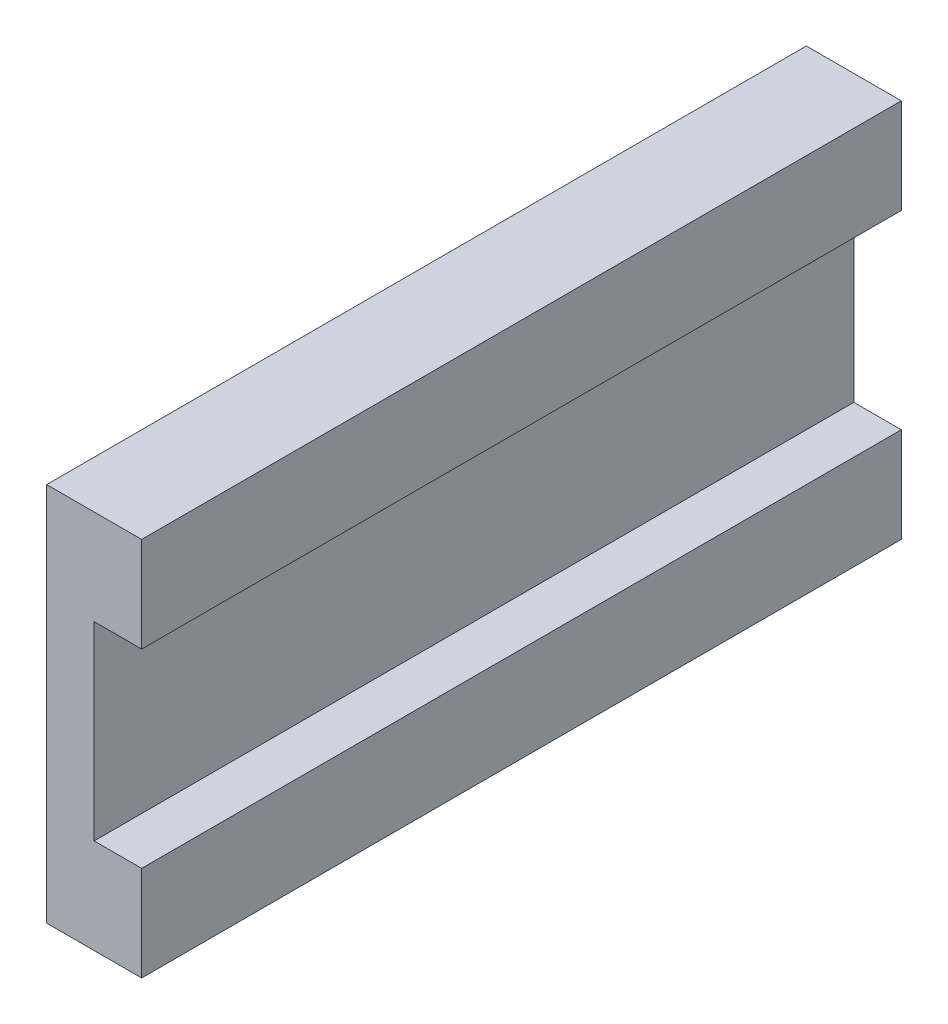
ISO-10303-21;
HEADER;
FILE_DESCRIPTION(('STEP AP214'),'2;1');
FILE_NAME('part.step','',(''),(''),'','','');
FILE_SCHEMA(('AUTOMOTIVE_DESIGN { 1 0 10303 214 1 1 1 1 }'));
ENDSEC;
DATA;
#1=APPLICATION_CONTEXT('core data for automotive mechanical design processes');
#2=APPLICATION_PROTOCOL_DEFINITION('international standard','automotive_design',2000,#1);
#3=PRODUCT_CONTEXT('',#1,'mechanical');
#4=PRODUCT('Part','Part','',(#3));
#5=PRODUCT_RELATED_PRODUCT_CATEGORY('part','',(#4));
#6=PRODUCT_DEFINITION_FORMATION('','',#4);
#7=PRODUCT_DEFINITION_CONTEXT('part definition',#1,'design');
#8=PRODUCT_DEFINITION('design','',#6,#7);
#9=PRODUCT_DEFINITION_SHAPE('','',#8);
#10=(LENGTH_UNIT() NAMED_UNIT(*) SI_UNIT(.MILLI.,.METRE.));
#11=(NAMED_UNIT(*) PLANE_ANGLE_UNIT() SI_UNIT($,.RADIAN.));
#12=(NAMED_UNIT(*) SI_UNIT($,.STERADIAN.) SOLID_ANGLE_UNIT());
#13=UNCERTAINTY_MEASURE_WITH_UNIT(LENGTH_MEASURE(1.E-05),#10,'distance_accuracy_value','');
#14=(GEOMETRIC_REPRESENTATION_CONTEXT(3) GLOBAL_UNCERTAINTY_ASSIGNED_CONTEXT((#13)) GLOBAL_UNIT_ASSIGNED_CONTEXT((#10,
#11,#12)) REPRESENTATION_CONTEXT('',''));
#15=CARTESIAN_POINT('',(0.,0.,0.));
#16=DIRECTION('',(0.,0.,1.));
#17=DIRECTION('',(1.,0.,0.));
#18=AXIS2_PLACEMENT_3D('',#15,#16,#17);
#19=CARTESIAN_POINT('',(20.,0.,80.));
#20=DIRECTION('',(0.,1.,0.));
#21=DIRECTION('',(0.,0.,1.));
#22=AXIS2_PLACEMENT_3D('',#19,#20,#21);
#23=PLANE('',#22);
#24=DIRECTION('',(1.,0.,0.));
#25=VECTOR('',#24,1.);
#26=CARTESIAN_POINT('',(20.,0.,-80.));
#27=LINE('',#26,#25);
#28=CARTESIAN_POINT('',(0.,0.,-80.));
#29=VERTEX_POINT('',#28);
#30=CARTESIAN_POINT('',(20.,0.,-80.));
#31=VERTEX_POINT('',#30);
#32=EDGE_CURVE('E131',#29,#31,#27,.T.);
#33=ORIENTED_EDGE('',*,*,#32,.T.);
#34=DIRECTION('',(0.,0.,-1.));
#35=VECTOR('',#34,1.);
#36=CARTESIAN_POINT('',(20.,0.,80.));
#37=LINE('',#36,#35);
#38=CARTESIAN_POINT('',(20.,0.,80.));
#39=VERTEX_POINT('',#38);
#40=EDGE_CURVE('E11',#39,#31,#37,.T.);
#41=ORIENTED_EDGE('',*,*,#40,.F.);
#42=DIRECTION('',(1.,0.,0.));
#43=VECTOR('',#42,1.);
#44=CARTESIAN_POINT('',(20.,0.,80.));
#45=LINE('',#44,#43);
#46=CARTESIAN_POINT('',(0.,0.,80.));
#47=VERTEX_POINT('',#46);
#48=EDGE_CURVE('E145',#47,#39,#45,.T.);
#49=ORIENTED_EDGE('',*,*,#48,.F.);
#50=DIRECTION('',(0.,0.,-1.));
#51=VECTOR('',#50,1.);
#52=CARTESIAN_POINT('',(0.,0.,80.));
#53=LINE('',#52,#51);
#54=EDGE_CURVE('E127',#47,#29,#53,.T.);
#55=ORIENTED_EDGE('',*,*,#54,.T.);
#56=EDGE_LOOP('',(#33,#41,#49,#55));
#57=FACE_BOUND('',#56,.T.);
#58=ADVANCED_FACE('F35',(#57),#23,.F.);
#59=CARTESIAN_POINT('',(20.,20.,80.));
#60=DIRECTION('',(-1.,0.,0.));
#61=DIRECTION('',(0.,-1.,0.));
#62=AXIS2_PLACEMENT_3D('',#59,#60,#61);
#63=PLANE('',#62);
#64=DIRECTION('',(0.,1.,0.));
#65=VECTOR('',#64,1.);
#66=CARTESIAN_POINT('',(20.,20.,-80.));
#67=LINE('',#66,#65);
#68=CARTESIAN_POINT('',(20.,20.,-80.));
#69=VERTEX_POINT('',#68);
#70=EDGE_CURVE('E134',#31,#69,#67,.T.);
#71=ORIENTED_EDGE('',*,*,#70,.T.);
#72=DIRECTION('',(0.,0.,-1.));
#73=VECTOR('',#72,1.);
#74=CARTESIAN_POINT('',(20.,20.,80.));
#75=LINE('',#74,#73);
#76=CARTESIAN_POINT('',(20.,20.,80.));
#77=VERTEX_POINT('',#76);
#78=EDGE_CURVE('E43',#77,#69,#75,.T.);
#79=ORIENTED_EDGE('',*,*,#78,.F.);
#80=DIRECTION('',(0.,1.,0.));
#81=VECTOR('',#80,1.);
#82=CARTESIAN_POINT('',(20.,20.,80.));
#83=LINE('',#82,#81);
#84=EDGE_CURVE('E94',#39,#77,#83,.T.);
#85=ORIENTED_EDGE('',*,*,#84,.F.);
#86=ORIENTED_EDGE('',*,*,#40,.T.);
#87=EDGE_LOOP('',(#71,#79,#85,#86));
#88=FACE_BOUND('',#87,.T.);
#89=ADVANCED_FACE('F180',(#88),#63,.F.);
#90=CARTESIAN_POINT('',(10.,20.,80.));
#91=DIRECTION('',(0.,-1.,0.));
#92=DIRECTION('',(0.,0.,-1.));
#93=AXIS2_PLACEMENT_3D('',#90,#91,#92);
#94=PLANE('',#93);
#95=DIRECTION('',(-1.,0.,0.));
#96=VECTOR('',#95,1.);
#97=CARTESIAN_POINT('',(10.,20.,-80.));
#98=LINE('',#97,#96);
#99=CARTESIAN_POINT('',(10.,20.,-80.));
#100=VERTEX_POINT('',#99);
#101=EDGE_CURVE('E136',#69,#100,#98,.T.);
#102=ORIENTED_EDGE('',*,*,#101,.T.);
#103=DIRECTION('',(0.,0.,-1.));
#104=VECTOR('',#103,1.);
#105=CARTESIAN_POINT('',(10.,20.,80.));
#106=LINE('',#105,#104);
#107=CARTESIAN_POINT('',(10.,20.,80.));
#108=VERTEX_POINT('',#107);
#109=EDGE_CURVE('E152',#108,#100,#106,.T.);
#110=ORIENTED_EDGE('',*,*,#109,.F.);
#111=DIRECTION('',(-1.,0.,0.));
#112=VECTOR('',#111,1.);
#113=CARTESIAN_POINT('',(10.,20.,80.));
#114=LINE('',#113,#112);
#115=EDGE_CURVE('E160',#77,#108,#114,.T.);
#116=ORIENTED_EDGE('',*,*,#115,.F.);
#117=ORIENTED_EDGE('',*,*,#78,.T.);
#118=EDGE_LOOP('',(#102,#110,#116,#117));
#119=FACE_BOUND('',#118,.T.);
#120=ADVANCED_FACE('F158',(#119),#94,.F.);
#121=CARTESIAN_POINT('',(10.,60.,80.));
#122=DIRECTION('',(-1.,0.,0.));
#123=DIRECTION('',(0.,-1.,0.));
#124=AXIS2_PLACEMENT_3D('',#121,#122,#123);
#125=PLANE('',#124);
#126=DIRECTION('',(0.,1.,0.));
#127=VECTOR('',#126,1.);
#128=CARTESIAN_POINT('',(10.,60.,-80.));
#129=LINE('',#128,#127);
#130=CARTESIAN_POINT('',(10.,60.,-80.));
#131=VERTEX_POINT('',#130);
#132=EDGE_CURVE('E138',#100,#131,#129,.T.);
#133=ORIENTED_EDGE('',*,*,#132,.T.);
#134=DIRECTION('',(0.,0.,-1.));
#135=VECTOR('',#134,1.);
#136=CARTESIAN_POINT('',(10.,60.,80.));
#137=LINE('',#136,#135);
#138=CARTESIAN_POINT('',(10.,60.,80.));
#139=VERTEX_POINT('',#138);
#140=EDGE_CURVE('E149',#139,#131,#137,.T.);
#141=ORIENTED_EDGE('',*,*,#140,.F.);
#142=DIRECTION('',(0.,1.,0.));
#143=VECTOR('',#142,1.);
#144=CARTESIAN_POINT('',(10.,60.,80.));
#145=LINE('',#144,#143);
#146=EDGE_CURVE('E172',#108,#139,#145,.T.);
#147=ORIENTED_EDGE('',*,*,#146,.F.);
#148=ORIENTED_EDGE('',*,*,#109,.T.);
#149=EDGE_LOOP('',(#133,#141,#147,#148));
#150=FACE_BOUND('',#149,.T.);
#151=ADVANCED_FACE('F168',(#150),#125,.F.);
#152=CARTESIAN_POINT('',(20.,60.,80.));
#153=DIRECTION('',(0.,1.,0.));
#154=DIRECTION('',(0.,0.,1.));
#155=AXIS2_PLACEMENT_3D('',#152,#153,#154);
#156=PLANE('',#155);
#157=DIRECTION('',(1.,0.,0.));
#158=VECTOR('',#157,1.);
#159=CARTESIAN_POINT('',(20.,60.,-80.));
#160=LINE('',#159,#158);
#161=CARTESIAN_POINT('',(20.,60.,-80.));
#162=VERTEX_POINT('',#161);
#163=EDGE_CURVE('E140',#131,#162,#160,.T.);
#164=ORIENTED_EDGE('',*,*,#163,.T.);
#165=DIRECTION('',(0.,0.,-1.));
#166=VECTOR('',#165,1.);
#167=CARTESIAN_POINT('',(20.,60.,80.));
#168=LINE('',#167,#166);
#169=CARTESIAN_POINT('',(20.,60.,80.));
#170=VERTEX_POINT('',#169);
#171=EDGE_CURVE('E122',#170,#162,#168,.T.);
#172=ORIENTED_EDGE('',*,*,#171,.F.);
#173=DIRECTION('',(1.,0.,0.));
#174=VECTOR('',#173,1.);
#175=CARTESIAN_POINT('',(20.,60.,80.));
#176=LINE('',#175,#174);
#177=EDGE_CURVE('E113',#139,#170,#176,.T.);
#178=ORIENTED_EDGE('',*,*,#177,.F.);
#179=ORIENTED_EDGE('',*,*,#140,.T.);
#180=EDGE_LOOP('',(#164,#172,#178,#179));
#181=FACE_BOUND('',#180,.T.);
#182=ADVANCED_FACE('F171',(#181),#156,.F.);
#183=CARTESIAN_POINT('',(20.,80.,80.));
#184=DIRECTION('',(-1.,0.,0.));
#185=DIRECTION('',(0.,-1.,0.));
#186=AXIS2_PLACEMENT_3D('',#183,#184,#185);
#187=PLANE('',#186);
#188=DIRECTION('',(0.,1.,0.));
#189=VECTOR('',#188,1.);
#190=CARTESIAN_POINT('',(20.,80.,-80.));
#191=LINE('',#190,#189);
#192=CARTESIAN_POINT('',(20.,80.,-80.));
#193=VERTEX_POINT('',#192);
#194=EDGE_CURVE('E121',#162,#193,#191,.T.);
#195=ORIENTED_EDGE('',*,*,#194,.T.);
#196=DIRECTION('',(0.,0.,-1.));
#197=VECTOR('',#196,1.);
#198=CARTESIAN_POINT('',(20.,80.,80.));
#199=LINE('',#198,#197);
#200=CARTESIAN_POINT('',(20.,80.,80.));
#201=VERTEX_POINT('',#200);
#202=EDGE_CURVE('E118',#201,#193,#199,.T.);
#203=ORIENTED_EDGE('',*,*,#202,.F.);
#204=DIRECTION('',(0.,1.,0.));
#205=VECTOR('',#204,1.);
#206=CARTESIAN_POINT('',(20.,80.,80.));
#207=LINE('',#206,#205);
#208=EDGE_CURVE('E107',#170,#201,#207,.T.);
#209=ORIENTED_EDGE('',*,*,#208,.F.);
#210=ORIENTED_EDGE('',*,*,#171,.T.);
#211=EDGE_LOOP('',(#195,#203,#209,#210));
#212=FACE_BOUND('',#211,.T.);
#213=ADVANCED_FACE('F119',(#212),#187,.F.);
#214=CARTESIAN_POINT('',(0.,80.,80.));
#215=DIRECTION('',(0.,-1.,0.));
#216=DIRECTION('',(0.,0.,-1.));
#217=AXIS2_PLACEMENT_3D('',#214,#215,#216);
#218=PLANE('',#217);
#219=DIRECTION('',(-1.,0.,0.));
#220=VECTOR('',#219,1.);
#221=CARTESIAN_POINT('',(0.,80.,-80.));
#222=LINE('',#221,#220);
#223=CARTESIAN_POINT('',(0.,80.,-80.));
#224=VERTEX_POINT('',#223);
#225=EDGE_CURVE('E80',#193,#224,#222,.T.);
#226=ORIENTED_EDGE('',*,*,#225,.T.);
#227=DIRECTION('',(0.,0.,-1.));
#228=VECTOR('',#227,1.);
#229=CARTESIAN_POINT('',(0.,80.,80.));
#230=LINE('',#229,#228);
#231=CARTESIAN_POINT('',(0.,80.,80.));
#232=VERTEX_POINT('',#231);
#233=EDGE_CURVE('E123',#232,#224,#230,.T.);
#234=ORIENTED_EDGE('',*,*,#233,.F.);
#235=DIRECTION('',(-1.,0.,0.));
#236=VECTOR('',#235,1.);
#237=CARTESIAN_POINT('',(0.,80.,80.));
#238=LINE('',#237,#236);
#239=EDGE_CURVE('E111',#201,#232,#238,.T.);
#240=ORIENTED_EDGE('',*,*,#239,.F.);
#241=ORIENTED_EDGE('',*,*,#202,.T.);
#242=EDGE_LOOP('',(#226,#234,#240,#241));
#243=FACE_BOUND('',#242,.T.);
#244=ADVANCED_FACE('F125',(#243),#218,.F.);
#245=CARTESIAN_POINT('',(0.,0.,80.));
#246=DIRECTION('',(1.,0.,0.));
#247=DIRECTION('',(0.,0.,-1.));
#248=AXIS2_PLACEMENT_3D('',#245,#246,#247);
#249=PLANE('',#248);
#250=DIRECTION('',(0.,-1.,0.));
#251=VECTOR('',#250,1.);
#252=CARTESIAN_POINT('',(0.,0.,-80.));
#253=LINE('',#252,#251);
#254=EDGE_CURVE('E86',#224,#29,#253,.T.);
#255=ORIENTED_EDGE('',*,*,#254,.T.);
#256=ORIENTED_EDGE('',*,*,#54,.F.);
#257=DIRECTION('',(0.,-1.,0.));
#258=VECTOR('',#257,1.);
#259=CARTESIAN_POINT('',(0.,0.,80.));
#260=LINE('',#259,#258);
#261=EDGE_CURVE('E51',#232,#47,#260,.T.);
#262=ORIENTED_EDGE('',*,*,#261,.F.);
#263=ORIENTED_EDGE('',*,*,#233,.T.);
#264=EDGE_LOOP('',(#255,#256,#262,#263));
#265=FACE_BOUND('',#264,.T.);
#266=ADVANCED_FACE('F196',(#265),#249,.F.);
#267=CARTESIAN_POINT('',(0.,0.,80.));
#268=DIRECTION('',(0.,0.,-1.));
#269=DIRECTION('',(-1.,0.,0.));
#270=AXIS2_PLACEMENT_3D('',#267,#268,#269);
#271=PLANE('',#270);
#272=ORIENTED_EDGE('',*,*,#48,.T.);
#273=ORIENTED_EDGE('',*,*,#84,.T.);
#274=ORIENTED_EDGE('',*,*,#115,.T.);
#275=ORIENTED_EDGE('',*,*,#146,.T.);
#276=ORIENTED_EDGE('',*,*,#177,.T.);
#277=ORIENTED_EDGE('',*,*,#208,.T.);
#278=ORIENTED_EDGE('',*,*,#239,.T.);
#279=ORIENTED_EDGE('',*,*,#261,.T.);
#280=EDGE_LOOP('',(#272,#273,#274,#275,#276,#277,#278,#279));
#281=FACE_BOUND('',#280,.T.);
#282=ADVANCED_FACE('F109',(#281),#271,.F.);
#283=CARTESIAN_POINT('',(0.,0.,-80.));
#284=DIRECTION('',(0.,0.,-1.));
#285=DIRECTION('',(-1.,0.,0.));
#286=AXIS2_PLACEMENT_3D('',#283,#284,#285);
#287=PLANE('',#286);
#288=ORIENTED_EDGE('',*,*,#32,.F.);
#289=ORIENTED_EDGE('',*,*,#254,.F.);
#290=ORIENTED_EDGE('',*,*,#225,.F.);
#291=ORIENTED_EDGE('',*,*,#194,.F.);
#292=ORIENTED_EDGE('',*,*,#163,.F.);
#293=ORIENTED_EDGE('',*,*,#132,.F.);
#294=ORIENTED_EDGE('',*,*,#101,.F.);
#295=ORIENTED_EDGE('',*,*,#70,.F.);
#296=EDGE_LOOP('',(#288,#289,#290,#291,#292,#293,#294,#295));
#297=FACE_BOUND('',#296,.T.);
#298=ADVANCED_FACE('F164',(#297),#287,.T.);
#299=CLOSED_SHELL('',(#58,#89,#120,#151,#182,#213,#244,#266,#282,#298));
#300=MANIFOLD_SOLID_BREP('B2',#299);
#301=ADVANCED_BREP_SHAPE_REPRESENTATION('',(#18,#300),#14);
#302=SHAPE_DEFINITION_REPRESENTATION(#9,#301);
ENDSEC;
END-ISO-10303-21;
